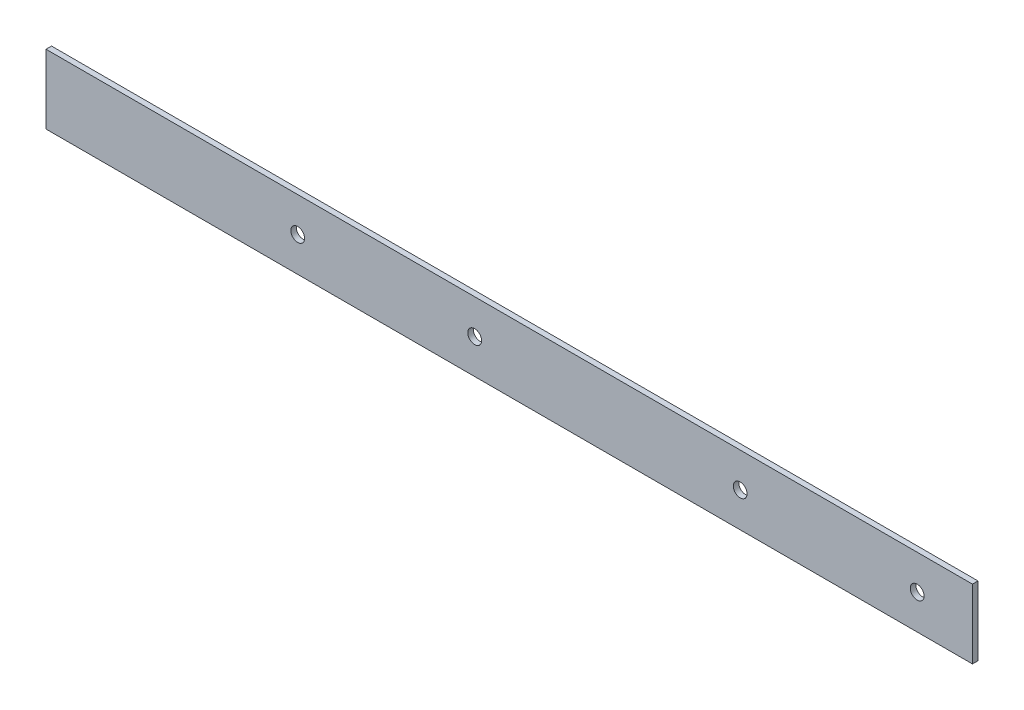
ISO-10303-21;
HEADER;
FILE_DESCRIPTION(('STEP AP214'),'2;1');
FILE_NAME('part.step','',(''),(''),'','','');
FILE_SCHEMA(('AUTOMOTIVE_DESIGN { 1 0 10303 214 1 1 1 1 }'));
ENDSEC;
DATA;
#1=APPLICATION_CONTEXT('core data for automotive mechanical design processes');
#2=APPLICATION_PROTOCOL_DEFINITION('international standard','automotive_design',2000,#1);
#3=PRODUCT_CONTEXT('',#1,'mechanical');
#4=PRODUCT('Part','Part','',(#3));
#5=PRODUCT_RELATED_PRODUCT_CATEGORY('part','',(#4));
#6=PRODUCT_DEFINITION_FORMATION('','',#4);
#7=PRODUCT_DEFINITION_CONTEXT('part definition',#1,'design');
#8=PRODUCT_DEFINITION('design','',#6,#7);
#9=PRODUCT_DEFINITION_SHAPE('','',#8);
#10=(LENGTH_UNIT() NAMED_UNIT(*) SI_UNIT(.MILLI.,.METRE.));
#11=(NAMED_UNIT(*) PLANE_ANGLE_UNIT() SI_UNIT($,.RADIAN.));
#12=(NAMED_UNIT(*) SI_UNIT($,.STERADIAN.) SOLID_ANGLE_UNIT());
#13=UNCERTAINTY_MEASURE_WITH_UNIT(LENGTH_MEASURE(1.E-05),#10,'distance_accuracy_value','');
#14=(GEOMETRIC_REPRESENTATION_CONTEXT(3) GLOBAL_UNCERTAINTY_ASSIGNED_CONTEXT((#13)) GLOBAL_UNIT_ASSIGNED_CONTEXT((#10,
#11,#12)) REPRESENTATION_CONTEXT('',''));
#15=CARTESIAN_POINT('',(0.,0.,0.));
#16=DIRECTION('',(0.,0.,1.));
#17=DIRECTION('',(1.,0.,0.));
#18=AXIS2_PLACEMENT_3D('',#15,#16,#17);
#19=CARTESIAN_POINT('',(167.5,12.5,2.));
#20=DIRECTION('',(-1.,0.,0.));
#21=DIRECTION('',(0.,0.,1.));
#22=AXIS2_PLACEMENT_3D('',#19,#20,#21);
#23=PLANE('',#22);
#24=DIRECTION('',(0.,1.,0.));
#25=VECTOR('',#24,1.);
#26=CARTESIAN_POINT('',(167.5,12.5,0.));
#27=LINE('',#26,#25);
#28=CARTESIAN_POINT('',(167.5,-12.5,0.));
#29=VERTEX_POINT('',#28);
#30=CARTESIAN_POINT('',(167.5,12.5,0.));
#31=VERTEX_POINT('',#30);
#32=EDGE_CURVE('E107',#29,#31,#27,.T.);
#33=ORIENTED_EDGE('',*,*,#32,.T.);
#34=DIRECTION('',(0.,0.,-1.));
#35=VECTOR('',#34,1.);
#36=CARTESIAN_POINT('',(167.5,12.5,2.));
#37=LINE('',#36,#35);
#38=CARTESIAN_POINT('',(167.5,12.5,2.));
#39=VERTEX_POINT('',#38);
#40=EDGE_CURVE('E11',#39,#31,#37,.T.);
#41=ORIENTED_EDGE('',*,*,#40,.F.);
#42=DIRECTION('',(0.,1.,0.));
#43=VECTOR('',#42,1.);
#44=CARTESIAN_POINT('',(167.5,12.5,2.));
#45=LINE('',#44,#43);
#46=CARTESIAN_POINT('',(167.5,-12.5,2.));
#47=VERTEX_POINT('',#46);
#48=EDGE_CURVE('E91',#47,#39,#45,.T.);
#49=ORIENTED_EDGE('',*,*,#48,.F.);
#50=DIRECTION('',(0.,0.,-1.));
#51=VECTOR('',#50,1.);
#52=CARTESIAN_POINT('',(167.5,-12.5,2.));
#53=LINE('',#52,#51);
#54=EDGE_CURVE('E103',#47,#29,#53,.T.);
#55=ORIENTED_EDGE('',*,*,#54,.T.);
#56=EDGE_LOOP('',(#33,#41,#49,#55));
#57=FACE_BOUND('',#56,.T.);
#58=ADVANCED_FACE('F39',(#57),#23,.F.);
#59=CARTESIAN_POINT('',(-167.5,12.5,2.));
#60=DIRECTION('',(0.,-1.,0.));
#61=DIRECTION('',(0.,0.,-1.));
#62=AXIS2_PLACEMENT_3D('',#59,#60,#61);
#63=PLANE('',#62);
#64=DIRECTION('',(-1.,0.,0.));
#65=VECTOR('',#64,1.);
#66=CARTESIAN_POINT('',(-167.5,12.5,0.));
#67=LINE('',#66,#65);
#68=CARTESIAN_POINT('',(-167.5,12.5,0.));
#69=VERTEX_POINT('',#68);
#70=EDGE_CURVE('E96',#31,#69,#67,.T.);
#71=ORIENTED_EDGE('',*,*,#70,.T.);
#72=DIRECTION('',(0.,0.,-1.));
#73=VECTOR('',#72,1.);
#74=CARTESIAN_POINT('',(-167.5,12.5,2.));
#75=LINE('',#74,#73);
#76=CARTESIAN_POINT('',(-167.5,12.5,2.));
#77=VERTEX_POINT('',#76);
#78=EDGE_CURVE('E48',#77,#69,#75,.T.);
#79=ORIENTED_EDGE('',*,*,#78,.F.);
#80=DIRECTION('',(-1.,0.,0.));
#81=VECTOR('',#80,1.);
#82=CARTESIAN_POINT('',(-167.5,12.5,2.));
#83=LINE('',#82,#81);
#84=EDGE_CURVE('E86',#39,#77,#83,.T.);
#85=ORIENTED_EDGE('',*,*,#84,.F.);
#86=ORIENTED_EDGE('',*,*,#40,.T.);
#87=EDGE_LOOP('',(#71,#79,#85,#86));
#88=FACE_BOUND('',#87,.T.);
#89=ADVANCED_FACE('F95',(#88),#63,.F.);
#90=CARTESIAN_POINT('',(-167.5,12.5,2.));
#91=DIRECTION('',(1.,0.,0.));
#92=DIRECTION('',(0.,0.,-1.));
#93=AXIS2_PLACEMENT_3D('',#90,#91,#92);
#94=PLANE('',#93);
#95=DIRECTION('',(0.,-1.,0.));
#96=VECTOR('',#95,1.);
#97=CARTESIAN_POINT('',(-167.5,12.5,0.));
#98=LINE('',#97,#96);
#99=CARTESIAN_POINT('',(-167.5,-12.5,0.));
#100=VERTEX_POINT('',#99);
#101=EDGE_CURVE('E73',#69,#100,#98,.T.);
#102=ORIENTED_EDGE('',*,*,#101,.T.);
#103=DIRECTION('',(0.,0.,-1.));
#104=VECTOR('',#103,1.);
#105=CARTESIAN_POINT('',(-167.5,-12.5,2.));
#106=LINE('',#105,#104);
#107=CARTESIAN_POINT('',(-167.5,-12.5,2.));
#108=VERTEX_POINT('',#107);
#109=EDGE_CURVE('E98',#108,#100,#106,.T.);
#110=ORIENTED_EDGE('',*,*,#109,.F.);
#111=DIRECTION('',(0.,-1.,0.));
#112=VECTOR('',#111,1.);
#113=CARTESIAN_POINT('',(-167.5,12.5,2.));
#114=LINE('',#113,#112);
#115=EDGE_CURVE('E89',#77,#108,#114,.T.);
#116=ORIENTED_EDGE('',*,*,#115,.F.);
#117=ORIENTED_EDGE('',*,*,#78,.T.);
#118=EDGE_LOOP('',(#102,#110,#116,#117));
#119=FACE_BOUND('',#118,.T.);
#120=ADVANCED_FACE('F99',(#119),#94,.F.);
#121=CARTESIAN_POINT('',(-167.5,-12.5,2.));
#122=DIRECTION('',(0.,1.,0.));
#123=DIRECTION('',(0.,0.,1.));
#124=AXIS2_PLACEMENT_3D('',#121,#122,#123);
#125=PLANE('',#124);
#126=DIRECTION('',(1.,0.,0.));
#127=VECTOR('',#126,1.);
#128=CARTESIAN_POINT('',(-167.5,-12.5,0.));
#129=LINE('',#128,#127);
#130=EDGE_CURVE('E79',#100,#29,#129,.T.);
#131=ORIENTED_EDGE('',*,*,#130,.T.);
#132=ORIENTED_EDGE('',*,*,#54,.F.);
#133=DIRECTION('',(1.,0.,0.));
#134=VECTOR('',#133,1.);
#135=CARTESIAN_POINT('',(-167.5,-12.5,2.));
#136=LINE('',#135,#134);
#137=EDGE_CURVE('E56',#108,#47,#136,.T.);
#138=ORIENTED_EDGE('',*,*,#137,.F.);
#139=ORIENTED_EDGE('',*,*,#109,.T.);
#140=EDGE_LOOP('',(#131,#132,#138,#139));
#141=FACE_BOUND('',#140,.T.);
#142=ADVANCED_FACE('F121',(#141),#125,.F.);
#143=CARTESIAN_POINT('',(0.,0.,2.));
#144=DIRECTION('',(0.,0.,1.));
#145=DIRECTION('',(1.,0.,0.));
#146=AXIS2_PLACEMENT_3D('',#143,#144,#145);
#147=PLANE('',#146);
#148=CARTESIAN_POINT('',(-76.5,0.,2.));
#149=DIRECTION('',(0.,0.,1.));
#150=DIRECTION('',(1.,0.,0.));
#151=AXIS2_PLACEMENT_3D('',#148,#149,#150);
#152=CIRCLE('',#151,2.5);
#153=CARTESIAN_POINT('',(-74.,0.,2.));
#154=VERTEX_POINT('',#153);
#155=EDGE_CURVE('E152',#154,#154,#152,.T.);
#156=ORIENTED_EDGE('',*,*,#155,.F.);
#157=EDGE_LOOP('',(#156));
#158=FACE_BOUND('',#157,.T.);
#159=CARTESIAN_POINT('',(-12.5,0.,2.));
#160=DIRECTION('',(0.,0.,1.));
#161=DIRECTION('',(1.,0.,0.));
#162=AXIS2_PLACEMENT_3D('',#159,#160,#161);
#163=CIRCLE('',#162,2.5);
#164=CARTESIAN_POINT('',(-9.99999999999998,0.,2.));
#165=VERTEX_POINT('',#164);
#166=EDGE_CURVE('E144',#165,#165,#163,.T.);
#167=ORIENTED_EDGE('',*,*,#166,.F.);
#168=EDGE_LOOP('',(#167));
#169=FACE_BOUND('',#168,.T.);
#170=CARTESIAN_POINT('',(83.5,0.,2.));
#171=DIRECTION('',(0.,0.,1.));
#172=DIRECTION('',(1.,0.,0.));
#173=AXIS2_PLACEMENT_3D('',#170,#171,#172);
#174=CIRCLE('',#173,2.5);
#175=CARTESIAN_POINT('',(86.,0.,2.));
#176=VERTEX_POINT('',#175);
#177=EDGE_CURVE('E136',#176,#176,#174,.T.);
#178=ORIENTED_EDGE('',*,*,#177,.F.);
#179=EDGE_LOOP('',(#178));
#180=FACE_BOUND('',#179,.T.);
#181=CARTESIAN_POINT('',(147.5,0.,2.));
#182=DIRECTION('',(0.,0.,1.));
#183=DIRECTION('',(1.,0.,0.));
#184=AXIS2_PLACEMENT_3D('',#181,#182,#183);
#185=CIRCLE('',#184,2.5);
#186=CARTESIAN_POINT('',(150.,0.,2.));
#187=VERTEX_POINT('',#186);
#188=EDGE_CURVE('E128',#187,#187,#185,.T.);
#189=ORIENTED_EDGE('',*,*,#188,.F.);
#190=EDGE_LOOP('',(#189));
#191=FACE_BOUND('',#190,.T.);
#192=ORIENTED_EDGE('',*,*,#48,.T.);
#193=ORIENTED_EDGE('',*,*,#84,.T.);
#194=ORIENTED_EDGE('',*,*,#115,.T.);
#195=ORIENTED_EDGE('',*,*,#137,.T.);
#196=EDGE_LOOP('',(#192,#193,#194,#195));
#197=FACE_BOUND('',#196,.T.);
#198=ADVANCED_FACE('F87',(#158,#169,#180,#191,#197),#147,.T.);
#199=CARTESIAN_POINT('',(0.,0.,0.));
#200=DIRECTION('',(0.,0.,1.));
#201=DIRECTION('',(1.,0.,0.));
#202=AXIS2_PLACEMENT_3D('',#199,#200,#201);
#203=PLANE('',#202);
#204=CARTESIAN_POINT('',(-76.5,0.,0.));
#205=DIRECTION('',(0.,0.,1.));
#206=DIRECTION('',(1.,0.,0.));
#207=AXIS2_PLACEMENT_3D('',#204,#205,#206);
#208=CIRCLE('',#207,2.5);
#209=CARTESIAN_POINT('',(-74.,0.,0.));
#210=VERTEX_POINT('',#209);
#211=EDGE_CURVE('E111',#210,#210,#208,.T.);
#212=ORIENTED_EDGE('',*,*,#211,.T.);
#213=EDGE_LOOP('',(#212));
#214=FACE_BOUND('',#213,.T.);
#215=CARTESIAN_POINT('',(-12.5,0.,0.));
#216=DIRECTION('',(0.,0.,1.));
#217=DIRECTION('',(1.,0.,0.));
#218=AXIS2_PLACEMENT_3D('',#215,#216,#217);
#219=CIRCLE('',#218,2.5);
#220=CARTESIAN_POINT('',(-9.99999999999998,0.,0.));
#221=VERTEX_POINT('',#220);
#222=EDGE_CURVE('E148',#221,#221,#219,.T.);
#223=ORIENTED_EDGE('',*,*,#222,.T.);
#224=EDGE_LOOP('',(#223));
#225=FACE_BOUND('',#224,.T.);
#226=CARTESIAN_POINT('',(83.5,0.,0.));
#227=DIRECTION('',(0.,0.,1.));
#228=DIRECTION('',(1.,0.,0.));
#229=AXIS2_PLACEMENT_3D('',#226,#227,#228);
#230=CIRCLE('',#229,2.5);
#231=CARTESIAN_POINT('',(86.,0.,0.));
#232=VERTEX_POINT('',#231);
#233=EDGE_CURVE('E140',#232,#232,#230,.T.);
#234=ORIENTED_EDGE('',*,*,#233,.T.);
#235=EDGE_LOOP('',(#234));
#236=FACE_BOUND('',#235,.T.);
#237=CARTESIAN_POINT('',(147.5,0.,0.));
#238=DIRECTION('',(0.,0.,1.));
#239=DIRECTION('',(1.,0.,0.));
#240=AXIS2_PLACEMENT_3D('',#237,#238,#239);
#241=CIRCLE('',#240,2.5);
#242=CARTESIAN_POINT('',(150.,0.,0.));
#243=VERTEX_POINT('',#242);
#244=EDGE_CURVE('E132',#243,#243,#241,.T.);
#245=ORIENTED_EDGE('',*,*,#244,.T.);
#246=EDGE_LOOP('',(#245));
#247=FACE_BOUND('',#246,.T.);
#248=ORIENTED_EDGE('',*,*,#32,.F.);
#249=ORIENTED_EDGE('',*,*,#130,.F.);
#250=ORIENTED_EDGE('',*,*,#101,.F.);
#251=ORIENTED_EDGE('',*,*,#70,.F.);
#252=EDGE_LOOP('',(#248,#249,#250,#251));
#253=FACE_BOUND('',#252,.T.);
#254=ADVANCED_FACE('F124',(#214,#225,#236,#247,#253),#203,.F.);
#255=CARTESIAN_POINT('',(147.5,0.,0.));
#256=DIRECTION('',(0.,0.,1.));
#257=DIRECTION('',(1.,0.,0.));
#258=AXIS2_PLACEMENT_3D('',#255,#256,#257);
#259=CYLINDRICAL_SURFACE('',#258,2.5);
#260=ORIENTED_EDGE('',*,*,#244,.F.);
#261=EDGE_LOOP('',(#260));
#262=FACE_BOUND('',#261,.T.);
#263=ORIENTED_EDGE('',*,*,#188,.T.);
#264=EDGE_LOOP('',(#263));
#265=FACE_BOUND('',#264,.T.);
#266=ADVANCED_FACE('F178',(#262,#265),#259,.F.);
#267=CARTESIAN_POINT('',(83.5,0.,0.));
#268=DIRECTION('',(0.,0.,1.));
#269=DIRECTION('',(1.,0.,0.));
#270=AXIS2_PLACEMENT_3D('',#267,#268,#269);
#271=CYLINDRICAL_SURFACE('',#270,2.5);
#272=ORIENTED_EDGE('',*,*,#233,.F.);
#273=EDGE_LOOP('',(#272));
#274=FACE_BOUND('',#273,.T.);
#275=ORIENTED_EDGE('',*,*,#177,.T.);
#276=EDGE_LOOP('',(#275));
#277=FACE_BOUND('',#276,.T.);
#278=ADVANCED_FACE('F180',(#274,#277),#271,.F.);
#279=CARTESIAN_POINT('',(-12.5,0.,0.));
#280=DIRECTION('',(0.,0.,1.));
#281=DIRECTION('',(1.,0.,0.));
#282=AXIS2_PLACEMENT_3D('',#279,#280,#281);
#283=CYLINDRICAL_SURFACE('',#282,2.5);
#284=ORIENTED_EDGE('',*,*,#222,.F.);
#285=EDGE_LOOP('',(#284));
#286=FACE_BOUND('',#285,.T.);
#287=ORIENTED_EDGE('',*,*,#166,.T.);
#288=EDGE_LOOP('',(#287));
#289=FACE_BOUND('',#288,.T.);
#290=ADVANCED_FACE('F165',(#286,#289),#283,.F.);
#291=CARTESIAN_POINT('',(-76.5,0.,0.));
#292=DIRECTION('',(0.,0.,1.));
#293=DIRECTION('',(1.,0.,0.));
#294=AXIS2_PLACEMENT_3D('',#291,#292,#293);
#295=CYLINDRICAL_SURFACE('',#294,2.5);
#296=ORIENTED_EDGE('',*,*,#211,.F.);
#297=EDGE_LOOP('',(#296));
#298=FACE_BOUND('',#297,.T.);
#299=ORIENTED_EDGE('',*,*,#155,.T.);
#300=EDGE_LOOP('',(#299));
#301=FACE_BOUND('',#300,.T.);
#302=ADVANCED_FACE('F162',(#298,#301),#295,.F.);
#303=CLOSED_SHELL('',(#58,#89,#120,#142,#198,#254,#266,#278,#290,#302));
#304=MANIFOLD_SOLID_BREP('B2',#303);
#305=ADVANCED_BREP_SHAPE_REPRESENTATION('',(#18,#304),#14);
#306=SHAPE_DEFINITION_REPRESENTATION(#9,#305);
ENDSEC;
END-ISO-10303-21;
